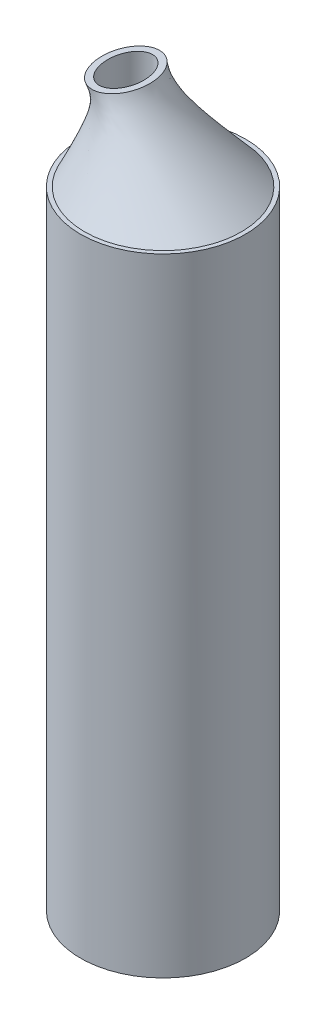
ISO-10303-21;
HEADER;
FILE_DESCRIPTION(('STEP AP214'),'2;1');
FILE_NAME('part.step','',(''),(''),'','','');
FILE_SCHEMA(('AUTOMOTIVE_DESIGN { 1 0 10303 214 1 1 1 1 }'));
ENDSEC;
DATA;
#1=APPLICATION_CONTEXT('core data for automotive mechanical design processes');
#2=APPLICATION_PROTOCOL_DEFINITION('international standard','automotive_design',2000,#1);
#3=PRODUCT_CONTEXT('',#1,'mechanical');
#4=PRODUCT('Part','Part','',(#3));
#5=PRODUCT_RELATED_PRODUCT_CATEGORY('part','',(#4));
#6=PRODUCT_DEFINITION_FORMATION('','',#4);
#7=PRODUCT_DEFINITION_CONTEXT('part definition',#1,'design');
#8=PRODUCT_DEFINITION('design','',#6,#7);
#9=PRODUCT_DEFINITION_SHAPE('','',#8);
#10=(LENGTH_UNIT() NAMED_UNIT(*) SI_UNIT(.MILLI.,.METRE.));
#11=(NAMED_UNIT(*) PLANE_ANGLE_UNIT() SI_UNIT($,.RADIAN.));
#12=(NAMED_UNIT(*) SI_UNIT($,.STERADIAN.) SOLID_ANGLE_UNIT());
#13=UNCERTAINTY_MEASURE_WITH_UNIT(LENGTH_MEASURE(1.E-05),#10,'distance_accuracy_value','');
#14=(GEOMETRIC_REPRESENTATION_CONTEXT(3) GLOBAL_UNCERTAINTY_ASSIGNED_CONTEXT((#13)) GLOBAL_UNIT_ASSIGNED_CONTEXT((#10,
#11,#12)) REPRESENTATION_CONTEXT('',''));
#15=CARTESIAN_POINT('',(0.,0.,0.));
#16=DIRECTION('',(0.,0.,1.));
#17=DIRECTION('',(1.,0.,0.));
#18=AXIS2_PLACEMENT_3D('',#15,#16,#17);
#19=CARTESIAN_POINT('',(-9.02006543574257,170.,0.));
#20=DIRECTION('',(0.,1.,0.));
#21=DIRECTION('',(0.,0.,1.));
#22=AXIS2_PLACEMENT_3D('',#19,#20,#21);
#23=PLANE('',#22);
#24=CARTESIAN_POINT('',(-9.02006543574257,170.,0.));
#25=DIRECTION('',(0.,1.,0.));
#26=DIRECTION('',(0.,0.,-1.));
#27=AXIS2_PLACEMENT_3D('',#24,#25,#26);
#28=ELLIPSE('',#27,6.47358437735325,4.3566302444743);
#29=CARTESIAN_POINT('',(-9.02006543574257,170.,-6.47358437735325));
#30=VERTEX_POINT('',#29);
#31=EDGE_CURVE('E127',#30,#30,#28,.T.);
#32=ORIENTED_EDGE('',*,*,#31,.F.);
#33=EDGE_LOOP('',(#32));
#34=FACE_BOUND('',#33,.T.);
#35=CARTESIAN_POINT('',(-9.02006543574257,170.,0.));
#36=DIRECTION('',(0.,1.,0.));
#37=DIRECTION('',(0.,0.,1.));
#38=AXIS2_PLACEMENT_3D('',#35,#36,#37);
#39=ELLIPSE('',#38,8.19169207939827,5.78321456536837);
#40=CARTESIAN_POINT('',(-9.02006543574257,170.,8.19169207939827));
#41=VERTEX_POINT('',#40);
#42=EDGE_CURVE('E12',#41,#41,#39,.T.);
#43=ORIENTED_EDGE('',*,*,#42,.T.);
#44=EDGE_LOOP('',(#43));
#45=FACE_BOUND('',#44,.T.);
#46=ADVANCED_FACE('F51',(#34,#45),#23,.T.);
#47=CARTESIAN_POINT('',(0.,150.,0.));
#48=DIRECTION('',(0.,1.,0.));
#49=DIRECTION('',(0.,0.,1.));
#50=AXIS2_PLACEMENT_3D('',#47,#48,#49);
#51=PLANE('',#50);
#52=CARTESIAN_POINT('',(-9.02006543574257,150.,0.));
#53=DIRECTION('',(0.,1.,0.));
#54=DIRECTION('',(0.,0.,-1.));
#55=AXIS2_PLACEMENT_3D('',#52,#53,#54);
#56=ELLIPSE('',#55,6.47358437735325,4.3566302444743);
#57=CARTESIAN_POINT('',(-9.02006543574257,150.,-6.47358437735325));
#58=VERTEX_POINT('',#57);
#59=EDGE_CURVE('E55',#58,#58,#56,.T.);
#60=ORIENTED_EDGE('',*,*,#59,.T.);
#61=EDGE_LOOP('',(#60));
#62=FACE_BOUND('',#61,.T.);
#63=CARTESIAN_POINT('',(0.,150.,0.));
#64=DIRECTION('',(0.,1.,0.));
#65=DIRECTION('',(0.,0.,1.));
#66=AXIS2_PLACEMENT_3D('',#63,#64,#65);
#67=CIRCLE('',#66,19.);
#68=CARTESIAN_POINT('',(0.,150.,19.));
#69=VERTEX_POINT('',#68);
#70=EDGE_CURVE('E59',#69,#69,#67,.T.);
#71=ORIENTED_EDGE('',*,*,#70,.F.);
#72=EDGE_LOOP('',(#71));
#73=FACE_BOUND('',#72,.T.);
#74=ADVANCED_FACE('F84',(#62,#73),#51,.F.);
#75=CARTESIAN_POINT('',(-17.6919957751894,150.,-6.92771863535745));
#76=CARTESIAN_POINT('',(-8.80561044710604,170.,-8.18605795158184));
#77=CARTESIAN_POINT('',(-31.5474330459043,150.,28.4562729150214));
#78=CARTESIAN_POINT('',(-20.3640843544933,170.,-8.79359177622021));
#79=CARTESIAN_POINT('',(3.83655850447453,150.,42.3117101857363));
#80=CARTESIAN_POINT('',(-20.7929943317663,170.,7.57852412694347));
#81=CARTESIAN_POINT('',(17.6919957751894,150.,6.92771863535746));
#82=CARTESIAN_POINT('',(-9.2345204243791,170.,8.18605795158184));
#83=CARTESIAN_POINT('',(31.5474330459044,150.,-28.4562729150214));
#84=CARTESIAN_POINT('',(2.32395348300811,170.,8.79359177622021));
#85=CARTESIAN_POINT('',(-3.83655850447451,150.,-42.3117101857363));
#86=CARTESIAN_POINT('',(2.75286346028117,170.,-7.57852412694347));
#87=CARTESIAN_POINT('',(-17.6919957751894,150.,-6.92771863535745));
#88=CARTESIAN_POINT('',(-8.80561044710604,170.,-8.18605795158184));
#89=(BOUNDED_SURFACE() B_SPLINE_SURFACE(3,1,((#75,#76),(#77,#78),(#79,#80),(#81,#82),(#83,#84),
(#85,#86),(#87,#88)),.UNSPECIFIED.,.T.,.F.,.F.) B_SPLINE_SURFACE_WITH_KNOTS((4,3,4),(2,2),(0.,
0.5,1.),(0.,1.),.UNSPECIFIED.) GEOMETRIC_REPRESENTATION_ITEM() RATIONAL_B_SPLINE_SURFACE(((1.,
1.),(0.333333333333334,0.333333333333333),(0.333333333333334,0.333333333333333),(1.,1.),
(0.333333333333333,0.333333333333333),(0.333333333333333,0.333333333333333),(1.,1.))) REPRESENTATION_ITEM('') SURFACE());
#90=ORIENTED_EDGE('',*,*,#70,.T.);
#91=EDGE_LOOP('',(#90));
#92=FACE_BOUND('',#91,.T.);
#93=ORIENTED_EDGE('',*,*,#42,.F.);
#94=EDGE_LOOP('',(#93));
#95=FACE_BOUND('',#94,.T.);
#96=ADVANCED_FACE('F93',(#92,#95),#89,.T.);
#97=CARTESIAN_POINT('',(-9.02006543574257,0.,0.));
#98=DIRECTION('',(0.,1.,0.));
#99=DIRECTION('',(0.,0.,-1.));
#100=AXIS2_PLACEMENT_3D('',#97,#98,#99);
#101=ELLIPSE('',#100,6.47358437735325,4.3566302444743);
#102=DIRECTION('',(0.,1.,0.));
#103=VECTOR('',#102,1.);
#104=SURFACE_OF_LINEAR_EXTRUSION('',#101,#103);
#105=ORIENTED_EDGE('',*,*,#31,.T.);
#106=EDGE_LOOP('',(#105));
#107=FACE_BOUND('',#106,.T.);
#108=ORIENTED_EDGE('',*,*,#59,.F.);
#109=EDGE_LOOP('',(#108));
#110=FACE_BOUND('',#109,.T.);
#111=ADVANCED_FACE('F95',(#107,#110),#104,.F.);
#112=CLOSED_SHELL('',(#46,#74,#96,#111));
#113=MANIFOLD_SOLID_BREP('B2',#112);
#114=CARTESIAN_POINT('',(0.,150.,0.));
#115=DIRECTION('',(0.,-1.,0.));
#116=DIRECTION('',(0.,0.,-1.));
#117=AXIS2_PLACEMENT_3D('',#114,#115,#116);
#118=CYLINDRICAL_SURFACE('',#117,19.);
#119=CARTESIAN_POINT('',(0.,40.,0.));
#120=DIRECTION('',(0.,1.,0.));
#121=DIRECTION('',(0.,0.,1.));
#122=AXIS2_PLACEMENT_3D('',#119,#120,#121);
#123=CIRCLE('',#122,19.);
#124=CARTESIAN_POINT('',(0.,40.,19.));
#125=VERTEX_POINT('',#124);
#126=EDGE_CURVE('E181',#125,#125,#123,.T.);
#127=ORIENTED_EDGE('',*,*,#126,.F.);
#128=EDGE_LOOP('',(#127));
#129=FACE_BOUND('',#128,.T.);
#130=CARTESIAN_POINT('',(0.,100.,0.));
#131=DIRECTION('',(0.,1.,0.));
#132=DIRECTION('',(0.,0.,1.));
#133=AXIS2_PLACEMENT_3D('',#130,#131,#132);
#134=CIRCLE('',#133,19.);
#135=CARTESIAN_POINT('',(0.,100.,19.));
#136=VERTEX_POINT('',#135);
#137=EDGE_CURVE('E243',#136,#136,#134,.T.);
#138=ORIENTED_EDGE('',*,*,#137,.T.);
#139=EDGE_LOOP('',(#138));
#140=FACE_BOUND('',#139,.T.);
#141=ADVANCED_FACE('F174',(#129,#140),#118,.F.);
#142=CARTESIAN_POINT('',(0.,0.,0.));
#143=DIRECTION('',(0.,1.,0.));
#144=DIRECTION('',(0.,0.,1.));
#145=AXIS2_PLACEMENT_3D('',#142,#143,#144);
#146=CIRCLE('',#145,19.);
#147=CARTESIAN_POINT('',(0.,0.,19.));
#148=VERTEX_POINT('',#147);
#149=EDGE_CURVE('E192',#148,#148,#146,.T.);
#150=ORIENTED_EDGE('',*,*,#149,.F.);
#151=EDGE_LOOP('',(#150));
#152=FACE_BOUND('',#151,.T.);
#153=CARTESIAN_POINT('',(0.,35.,0.));
#154=DIRECTION('',(0.,1.,0.));
#155=DIRECTION('',(0.,0.,1.));
#156=AXIS2_PLACEMENT_3D('',#153,#154,#155);
#157=CIRCLE('',#156,19.);
#158=CARTESIAN_POINT('',(0.,35.,19.));
#159=VERTEX_POINT('',#158);
#160=EDGE_CURVE('E236',#159,#159,#157,.T.);
#161=ORIENTED_EDGE('',*,*,#160,.T.);
#162=EDGE_LOOP('',(#161));
#163=FACE_BOUND('',#162,.T.);
#164=ADVANCED_FACE('F274',(#152,#163),#118,.F.);
#165=CARTESIAN_POINT('',(0.,0.,0.));
#166=DIRECTION('',(0.,-1.,0.));
#167=DIRECTION('',(0.,0.,-1.));
#168=AXIS2_PLACEMENT_3D('',#165,#166,#167);
#169=PLANE('',#168);
#170=CARTESIAN_POINT('',(-1.29367251925223,0.,12.4328762325108));
#171=DIRECTION('',(0.,-1.,0.));
#172=DIRECTION('',(0.,0.,-1.));
#173=AXIS2_PLACEMENT_3D('',#170,#171,#172);
#174=CIRCLE('',#173,5.);
#175=CARTESIAN_POINT('',(-1.29367251925223,0.,7.43287623251078));
#176=VERTEX_POINT('',#175);
#177=EDGE_CURVE('E224',#176,#176,#174,.F.);
#178=ORIENTED_EDGE('',*,*,#177,.F.);
#179=EDGE_LOOP('',(#178));
#180=FACE_BOUND('',#179,.T.);
#181=CARTESIAN_POINT('',(11.130848452992,0.,5.68807636345761));
#182=DIRECTION('',(0.,-1.,0.));
#183=DIRECTION('',(0.,0.,-1.));
#184=AXIS2_PLACEMENT_3D('',#181,#182,#183);
#185=CIRCLE('',#184,5.);
#186=CARTESIAN_POINT('',(11.130848452992,0.,0.688076363457607));
#187=VERTEX_POINT('',#186);
#188=EDGE_CURVE('E218',#187,#187,#185,.F.);
#189=ORIENTED_EDGE('',*,*,#188,.F.);
#190=EDGE_LOOP('',(#189));
#191=FACE_BOUND('',#190,.T.);
#192=CARTESIAN_POINT('',(9.31778208401549,0.,-8.33240283680524));
#193=DIRECTION('',(0.,-1.,0.));
#194=DIRECTION('',(0.,0.,-1.));
#195=AXIS2_PLACEMENT_3D('',#192,#193,#194);
#196=CIRCLE('',#195,5.);
#197=CARTESIAN_POINT('',(9.31778208401549,0.,-13.3324028368052));
#198=VERTEX_POINT('',#197);
#199=EDGE_CURVE('E210',#198,#198,#196,.F.);
#200=ORIENTED_EDGE('',*,*,#199,.F.);
#201=EDGE_LOOP('',(#200));
#202=FACE_BOUND('',#201,.T.);
#203=CARTESIAN_POINT('',(-5.45798063939538,0.,-11.2454634115267));
#204=DIRECTION('',(0.,-1.,0.));
#205=DIRECTION('',(0.,0.,-1.));
#206=AXIS2_PLACEMENT_3D('',#203,#204,#205);
#207=CIRCLE('',#206,5.);
#208=CARTESIAN_POINT('',(-5.45798063939538,0.,-16.2454634115267));
#209=VERTEX_POINT('',#208);
#210=EDGE_CURVE('E211',#209,#209,#207,.F.);
#211=ORIENTED_EDGE('',*,*,#210,.F.);
#212=EDGE_LOOP('',(#211));
#213=FACE_BOUND('',#212,.T.);
#214=CARTESIAN_POINT('',(-12.311057922383,0.,2.16514499092599));
#215=DIRECTION('',(0.,-1.,0.));
#216=DIRECTION('',(0.,0.,-1.));
#217=AXIS2_PLACEMENT_3D('',#214,#215,#216);
#218=CIRCLE('',#217,5.00000000000001);
#219=CARTESIAN_POINT('',(-12.311057922383,0.,-2.83485500907401));
#220=VERTEX_POINT('',#219);
#221=EDGE_CURVE('E233',#220,#220,#218,.F.);
#222=ORIENTED_EDGE('',*,*,#221,.F.);
#223=EDGE_LOOP('',(#222));
#224=FACE_BOUND('',#223,.T.);
#225=ORIENTED_EDGE('',*,*,#149,.T.);
#226=EDGE_LOOP('',(#225));
#227=FACE_BOUND('',#226,.T.);
#228=CARTESIAN_POINT('',(0.,0.,0.));
#229=DIRECTION('',(0.,-1.,0.));
#230=DIRECTION('',(0.,0.,-1.));
#231=AXIS2_PLACEMENT_3D('',#228,#229,#230);
#232=CIRCLE('',#231,5.);
#233=CARTESIAN_POINT('',(0.,0.,-5.));
#234=VERTEX_POINT('',#233);
#235=EDGE_CURVE('E200',#234,#234,#232,.F.);
#236=ORIENTED_EDGE('',*,*,#235,.F.);
#237=EDGE_LOOP('',(#236));
#238=FACE_BOUND('',#237,.T.);
#239=ADVANCED_FACE('F281',(#180,#191,#202,#213,#224,#227,#238),#169,.F.);
#240=CARTESIAN_POINT('',(0.,150.,0.));
#241=DIRECTION('',(0.,1.,0.));
#242=DIRECTION('',(0.,0.,1.));
#243=AXIS2_PLACEMENT_3D('',#240,#241,#242);
#244=PLANE('',#243);
#245=CARTESIAN_POINT('',(0.,150.,0.));
#246=DIRECTION('',(0.,1.,0.));
#247=DIRECTION('',(0.,0.,1.));
#248=AXIS2_PLACEMENT_3D('',#245,#246,#247);
#249=CIRCLE('',#248,20.);
#250=CARTESIAN_POINT('',(0.,150.,20.));
#251=VERTEX_POINT('',#250);
#252=EDGE_CURVE('E185',#251,#251,#249,.T.);
#253=ORIENTED_EDGE('',*,*,#252,.T.);
#254=EDGE_LOOP('',(#253));
#255=FACE_BOUND('',#254,.T.);
#256=CARTESIAN_POINT('',(0.,150.,0.));
#257=DIRECTION('',(0.,1.,0.));
#258=DIRECTION('',(0.,0.,1.));
#259=AXIS2_PLACEMENT_3D('',#256,#257,#258);
#260=CIRCLE('',#259,19.);
#261=CARTESIAN_POINT('',(0.,150.,19.));
#262=VERTEX_POINT('',#261);
#263=EDGE_CURVE('E189',#262,#262,#260,.T.);
#264=ORIENTED_EDGE('',*,*,#263,.F.);
#265=EDGE_LOOP('',(#264));
#266=FACE_BOUND('',#265,.T.);
#267=ADVANCED_FACE('F295',(#255,#266),#244,.T.);
#268=CARTESIAN_POINT('',(0.,150.,0.));
#269=DIRECTION('',(0.,-1.,0.));
#270=DIRECTION('',(0.,0.,-1.));
#271=AXIS2_PLACEMENT_3D('',#268,#269,#270);
#272=CYLINDRICAL_SURFACE('',#271,20.);
#273=ORIENTED_EDGE('',*,*,#252,.F.);
#274=EDGE_LOOP('',(#273));
#275=FACE_BOUND('',#274,.T.);
#276=CARTESIAN_POINT('',(0.,-2.,0.));
#277=DIRECTION('',(0.,-1.,0.));
#278=DIRECTION('',(0.,0.,-1.));
#279=AXIS2_PLACEMENT_3D('',#276,#277,#278);
#280=CIRCLE('',#279,20.);
#281=CARTESIAN_POINT('',(0.,-2.,-20.));
#282=VERTEX_POINT('',#281);
#283=EDGE_CURVE('E195',#282,#282,#280,.T.);
#284=ORIENTED_EDGE('',*,*,#283,.F.);
#285=EDGE_LOOP('',(#284));
#286=FACE_BOUND('',#285,.T.);
#287=ADVANCED_FACE('F176',(#275,#286),#272,.T.);
#288=CARTESIAN_POINT('',(0.,105.,0.));
#289=DIRECTION('',(0.,1.,0.));
#290=DIRECTION('',(0.,0.,1.));
#291=AXIS2_PLACEMENT_3D('',#288,#289,#290);
#292=CIRCLE('',#291,19.);
#293=CARTESIAN_POINT('',(0.,105.,19.));
#294=VERTEX_POINT('',#293);
#295=EDGE_CURVE('E50',#294,#294,#292,.T.);
#296=ORIENTED_EDGE('',*,*,#295,.F.);
#297=EDGE_LOOP('',(#296));
#298=FACE_BOUND('',#297,.T.);
#299=ORIENTED_EDGE('',*,*,#263,.T.);
#300=EDGE_LOOP('',(#299));
#301=FACE_BOUND('',#300,.T.);
#302=ADVANCED_FACE('F277',(#298,#301),#118,.F.);
#303=CARTESIAN_POINT('',(0.,-2.,0.));
#304=DIRECTION('',(0.,-1.,0.));
#305=DIRECTION('',(0.,0.,-1.));
#306=AXIS2_PLACEMENT_3D('',#303,#304,#305);
#307=PLANE('',#306);
#308=CARTESIAN_POINT('',(-1.29367251925223,-2.,12.4328762325108));
#309=DIRECTION('',(0.,-1.,0.));
#310=DIRECTION('',(0.,0.,-1.));
#311=AXIS2_PLACEMENT_3D('',#308,#309,#310);
#312=CIRCLE('',#311,5.);
#313=CARTESIAN_POINT('',(-1.29367251925223,-2.,7.43287623251078));
#314=VERTEX_POINT('',#313);
#315=EDGE_CURVE('E206',#314,#314,#312,.T.);
#316=ORIENTED_EDGE('',*,*,#315,.F.);
#317=EDGE_LOOP('',(#316));
#318=FACE_BOUND('',#317,.T.);
#319=CARTESIAN_POINT('',(11.130848452992,-2.,5.68807636345761));
#320=DIRECTION('',(0.,-1.,0.));
#321=DIRECTION('',(0.,0.,-1.));
#322=AXIS2_PLACEMENT_3D('',#319,#320,#321);
#323=CIRCLE('',#322,5.);
#324=CARTESIAN_POINT('',(11.130848452992,-2.,0.688076363457607));
#325=VERTEX_POINT('',#324);
#326=EDGE_CURVE('E221',#325,#325,#323,.T.);
#327=ORIENTED_EDGE('',*,*,#326,.F.);
#328=EDGE_LOOP('',(#327));
#329=FACE_BOUND('',#328,.T.);
#330=CARTESIAN_POINT('',(9.31778208401549,-2.,-8.33240283680524));
#331=DIRECTION('',(0.,-1.,0.));
#332=DIRECTION('',(0.,0.,-1.));
#333=AXIS2_PLACEMENT_3D('',#330,#331,#332);
#334=CIRCLE('',#333,5.);
#335=CARTESIAN_POINT('',(9.31778208401549,-2.,-13.3324028368052));
#336=VERTEX_POINT('',#335);
#337=EDGE_CURVE('E215',#336,#336,#334,.T.);
#338=ORIENTED_EDGE('',*,*,#337,.F.);
#339=EDGE_LOOP('',(#338));
#340=FACE_BOUND('',#339,.T.);
#341=CARTESIAN_POINT('',(-5.45798063939538,-2.,-11.2454634115267));
#342=DIRECTION('',(0.,-1.,0.));
#343=DIRECTION('',(0.,0.,-1.));
#344=AXIS2_PLACEMENT_3D('',#341,#342,#343);
#345=CIRCLE('',#344,5.);
#346=CARTESIAN_POINT('',(-5.45798063939538,-2.,-16.2454634115267));
#347=VERTEX_POINT('',#346);
#348=EDGE_CURVE('E207',#347,#347,#345,.T.);
#349=ORIENTED_EDGE('',*,*,#348,.F.);
#350=EDGE_LOOP('',(#349));
#351=FACE_BOUND('',#350,.T.);
#352=CARTESIAN_POINT('',(-12.311057922383,-2.,2.16514499092599));
#353=DIRECTION('',(0.,-1.,0.));
#354=DIRECTION('',(0.,0.,-1.));
#355=AXIS2_PLACEMENT_3D('',#352,#353,#354);
#356=CIRCLE('',#355,5.00000000000001);
#357=CARTESIAN_POINT('',(-12.311057922383,-2.,-2.83485500907401));
#358=VERTEX_POINT('',#357);
#359=EDGE_CURVE('E214',#358,#358,#356,.T.);
#360=ORIENTED_EDGE('',*,*,#359,.F.);
#361=EDGE_LOOP('',(#360));
#362=FACE_BOUND('',#361,.T.);
#363=CARTESIAN_POINT('',(0.,-2.,0.));
#364=DIRECTION('',(0.,-1.,0.));
#365=DIRECTION('',(0.,0.,-1.));
#366=AXIS2_PLACEMENT_3D('',#363,#364,#365);
#367=CIRCLE('',#366,5.);
#368=CARTESIAN_POINT('',(0.,-2.,-5.));
#369=VERTEX_POINT('',#368);
#370=EDGE_CURVE('E203',#369,#369,#367,.T.);
#371=ORIENTED_EDGE('',*,*,#370,.F.);
#372=EDGE_LOOP('',(#371));
#373=FACE_BOUND('',#372,.T.);
#374=ORIENTED_EDGE('',*,*,#283,.T.);
#375=EDGE_LOOP('',(#374));
#376=FACE_BOUND('',#375,.T.);
#377=ADVANCED_FACE('F286',(#318,#329,#340,#351,#362,#373,#376),#307,.T.);
#378=CARTESIAN_POINT('',(0.,170.0011,0.));
#379=DIRECTION('',(0.,-1.,0.));
#380=DIRECTION('',(0.,0.,-1.));
#381=AXIS2_PLACEMENT_3D('',#378,#379,#380);
#382=CYLINDRICAL_SURFACE('',#381,5.);
#383=ORIENTED_EDGE('',*,*,#370,.T.);
#384=EDGE_LOOP('',(#383));
#385=FACE_BOUND('',#384,.T.);
#386=ORIENTED_EDGE('',*,*,#235,.T.);
#387=EDGE_LOOP('',(#386));
#388=FACE_BOUND('',#387,.T.);
#389=ADVANCED_FACE('F292',(#385,#388),#382,.F.);
#390=CARTESIAN_POINT('',(-12.311057922383,170.0011,2.16514499092599));
#391=DIRECTION('',(0.,-1.,0.));
#392=DIRECTION('',(0.,0.,-1.));
#393=AXIS2_PLACEMENT_3D('',#390,#391,#392);
#394=CYLINDRICAL_SURFACE('',#393,5.00000000000001);
#395=ORIENTED_EDGE('',*,*,#359,.T.);
#396=EDGE_LOOP('',(#395));
#397=FACE_BOUND('',#396,.T.);
#398=ORIENTED_EDGE('',*,*,#221,.T.);
#399=EDGE_LOOP('',(#398));
#400=FACE_BOUND('',#399,.T.);
#401=ADVANCED_FACE('F317',(#397,#400),#394,.F.);
#402=CARTESIAN_POINT('',(-5.45798063939538,170.0011,-11.2454634115267));
#403=DIRECTION('',(0.,-1.,0.));
#404=DIRECTION('',(0.,0.,-1.));
#405=AXIS2_PLACEMENT_3D('',#402,#403,#404);
#406=CYLINDRICAL_SURFACE('',#405,5.);
#407=ORIENTED_EDGE('',*,*,#348,.T.);
#408=EDGE_LOOP('',(#407));
#409=FACE_BOUND('',#408,.T.);
#410=ORIENTED_EDGE('',*,*,#210,.T.);
#411=EDGE_LOOP('',(#410));
#412=FACE_BOUND('',#411,.T.);
#413=ADVANCED_FACE('F319',(#409,#412),#406,.F.);
#414=CARTESIAN_POINT('',(9.31778208401549,170.0011,-8.33240283680524));
#415=DIRECTION('',(0.,-1.,0.));
#416=DIRECTION('',(0.,0.,-1.));
#417=AXIS2_PLACEMENT_3D('',#414,#415,#416);
#418=CYLINDRICAL_SURFACE('',#417,5.);
#419=ORIENTED_EDGE('',*,*,#337,.T.);
#420=EDGE_LOOP('',(#419));
#421=FACE_BOUND('',#420,.T.);
#422=ORIENTED_EDGE('',*,*,#199,.T.);
#423=EDGE_LOOP('',(#422));
#424=FACE_BOUND('',#423,.T.);
#425=ADVANCED_FACE('F322',(#421,#424),#418,.F.);
#426=CARTESIAN_POINT('',(11.130848452992,170.0011,5.68807636345761));
#427=DIRECTION('',(0.,-1.,0.));
#428=DIRECTION('',(0.,0.,-1.));
#429=AXIS2_PLACEMENT_3D('',#426,#427,#428);
#430=CYLINDRICAL_SURFACE('',#429,5.);
#431=ORIENTED_EDGE('',*,*,#326,.T.);
#432=EDGE_LOOP('',(#431));
#433=FACE_BOUND('',#432,.T.);
#434=ORIENTED_EDGE('',*,*,#188,.T.);
#435=EDGE_LOOP('',(#434));
#436=FACE_BOUND('',#435,.T.);
#437=ADVANCED_FACE('F326',(#433,#436),#430,.F.);
#438=CARTESIAN_POINT('',(-1.29367251925223,170.0011,12.4328762325108));
#439=DIRECTION('',(0.,-1.,0.));
#440=DIRECTION('',(0.,0.,-1.));
#441=AXIS2_PLACEMENT_3D('',#438,#439,#440);
#442=CYLINDRICAL_SURFACE('',#441,5.);
#443=ORIENTED_EDGE('',*,*,#315,.T.);
#444=EDGE_LOOP('',(#443));
#445=FACE_BOUND('',#444,.T.);
#446=ORIENTED_EDGE('',*,*,#177,.T.);
#447=EDGE_LOOP('',(#446));
#448=FACE_BOUND('',#447,.T.);
#449=ADVANCED_FACE('F330',(#445,#448),#442,.F.);
#450=CARTESIAN_POINT('',(0.,40.,0.));
#451=DIRECTION('',(0.,1.,0.));
#452=DIRECTION('',(0.,0.,1.));
#453=AXIS2_PLACEMENT_3D('',#450,#451,#452);
#454=PLANE('',#453);
#455=ORIENTED_EDGE('',*,*,#126,.T.);
#456=EDGE_LOOP('',(#455));
#457=FACE_BOUND('',#456,.T.);
#458=CARTESIAN_POINT('',(0.,40.,0.));
#459=DIRECTION('',(0.,1.,0.));
#460=DIRECTION('',(0.,0.,1.));
#461=AXIS2_PLACEMENT_3D('',#458,#459,#460);
#462=CIRCLE('',#461,12.5);
#463=CARTESIAN_POINT('',(0.,40.,12.5));
#464=VERTEX_POINT('',#463);
#465=EDGE_CURVE('E239',#464,#464,#462,.T.);
#466=ORIENTED_EDGE('',*,*,#465,.F.);
#467=EDGE_LOOP('',(#466));
#468=FACE_BOUND('',#467,.T.);
#469=ADVANCED_FACE('F334',(#457,#468),#454,.T.);
#470=CARTESIAN_POINT('',(0.,35.,0.));
#471=DIRECTION('',(0.,1.,0.));
#472=DIRECTION('',(0.,0.,1.));
#473=AXIS2_PLACEMENT_3D('',#470,#471,#472);
#474=PLANE('',#473);
#475=ORIENTED_EDGE('',*,*,#160,.F.);
#476=EDGE_LOOP('',(#475));
#477=FACE_BOUND('',#476,.T.);
#478=CARTESIAN_POINT('',(0.,35.,0.));
#479=DIRECTION('',(0.,1.,0.));
#480=DIRECTION('',(0.,0.,1.));
#481=AXIS2_PLACEMENT_3D('',#478,#479,#480);
#482=CIRCLE('',#481,12.5);
#483=CARTESIAN_POINT('',(0.,35.,12.5));
#484=VERTEX_POINT('',#483);
#485=EDGE_CURVE('E240',#484,#484,#482,.T.);
#486=ORIENTED_EDGE('',*,*,#485,.T.);
#487=EDGE_LOOP('',(#486));
#488=FACE_BOUND('',#487,.T.);
#489=ADVANCED_FACE('F269',(#477,#488),#474,.F.);
#490=CARTESIAN_POINT('',(0.,40.,0.));
#491=DIRECTION('',(0.,-1.,0.));
#492=DIRECTION('',(0.,0.,-1.));
#493=AXIS2_PLACEMENT_3D('',#490,#491,#492);
#494=CYLINDRICAL_SURFACE('',#493,12.5);
#495=ORIENTED_EDGE('',*,*,#465,.T.);
#496=EDGE_LOOP('',(#495));
#497=FACE_BOUND('',#496,.T.);
#498=ORIENTED_EDGE('',*,*,#485,.F.);
#499=EDGE_LOOP('',(#498));
#500=FACE_BOUND('',#499,.T.);
#501=ADVANCED_FACE('F261',(#497,#500),#494,.F.);
#502=CARTESIAN_POINT('',(0.,105.,0.));
#503=DIRECTION('',(0.,1.,0.));
#504=DIRECTION('',(0.,0.,1.));
#505=AXIS2_PLACEMENT_3D('',#502,#503,#504);
#506=PLANE('',#505);
#507=ORIENTED_EDGE('',*,*,#295,.T.);
#508=EDGE_LOOP('',(#507));
#509=FACE_BOUND('',#508,.T.);
#510=CARTESIAN_POINT('',(0.,105.,0.));
#511=DIRECTION('',(0.,1.,0.));
#512=DIRECTION('',(0.,0.,1.));
#513=AXIS2_PLACEMENT_3D('',#510,#511,#512);
#514=CIRCLE('',#513,12.5);
#515=CARTESIAN_POINT('',(0.,105.,12.5));
#516=VERTEX_POINT('',#515);
#517=EDGE_CURVE('E248',#516,#516,#514,.T.);
#518=ORIENTED_EDGE('',*,*,#517,.F.);
#519=EDGE_LOOP('',(#518));
#520=FACE_BOUND('',#519,.T.);
#521=ADVANCED_FACE('F258',(#509,#520),#506,.T.);
#522=CARTESIAN_POINT('',(0.,100.,0.));
#523=DIRECTION('',(0.,1.,0.));
#524=DIRECTION('',(0.,0.,1.));
#525=AXIS2_PLACEMENT_3D('',#522,#523,#524);
#526=PLANE('',#525);
#527=ORIENTED_EDGE('',*,*,#137,.F.);
#528=EDGE_LOOP('',(#527));
#529=FACE_BOUND('',#528,.T.);
#530=CARTESIAN_POINT('',(0.,100.,0.));
#531=DIRECTION('',(0.,1.,0.));
#532=DIRECTION('',(0.,0.,1.));
#533=AXIS2_PLACEMENT_3D('',#530,#531,#532);
#534=CIRCLE('',#533,12.5);
#535=CARTESIAN_POINT('',(0.,100.,12.5));
#536=VERTEX_POINT('',#535);
#537=EDGE_CURVE('E249',#536,#536,#534,.T.);
#538=ORIENTED_EDGE('',*,*,#537,.T.);
#539=EDGE_LOOP('',(#538));
#540=FACE_BOUND('',#539,.T.);
#541=ADVANCED_FACE('F260',(#529,#540),#526,.F.);
#542=CARTESIAN_POINT('',(0.,105.,0.));
#543=DIRECTION('',(0.,-1.,0.));
#544=DIRECTION('',(0.,0.,-1.));
#545=AXIS2_PLACEMENT_3D('',#542,#543,#544);
#546=CYLINDRICAL_SURFACE('',#545,12.5);
#547=ORIENTED_EDGE('',*,*,#517,.T.);
#548=EDGE_LOOP('',(#547));
#549=FACE_BOUND('',#548,.T.);
#550=ORIENTED_EDGE('',*,*,#537,.F.);
#551=EDGE_LOOP('',(#550));
#552=FACE_BOUND('',#551,.T.);
#553=ADVANCED_FACE('F255',(#549,#552),#546,.F.);
#554=CLOSED_SHELL('',(#141,#164,#239,#267,#287,#302,#377,#389,#401,#413,#425,#437,#449,#469,
#489,#501,#521,#541,#553));
#555=MANIFOLD_SOLID_BREP('B7',#554);
#556=ADVANCED_BREP_SHAPE_REPRESENTATION('',(#18,#113,#555),#14);
#557=SHAPE_DEFINITION_REPRESENTATION(#9,#556);
ENDSEC;
END-ISO-10303-21;
